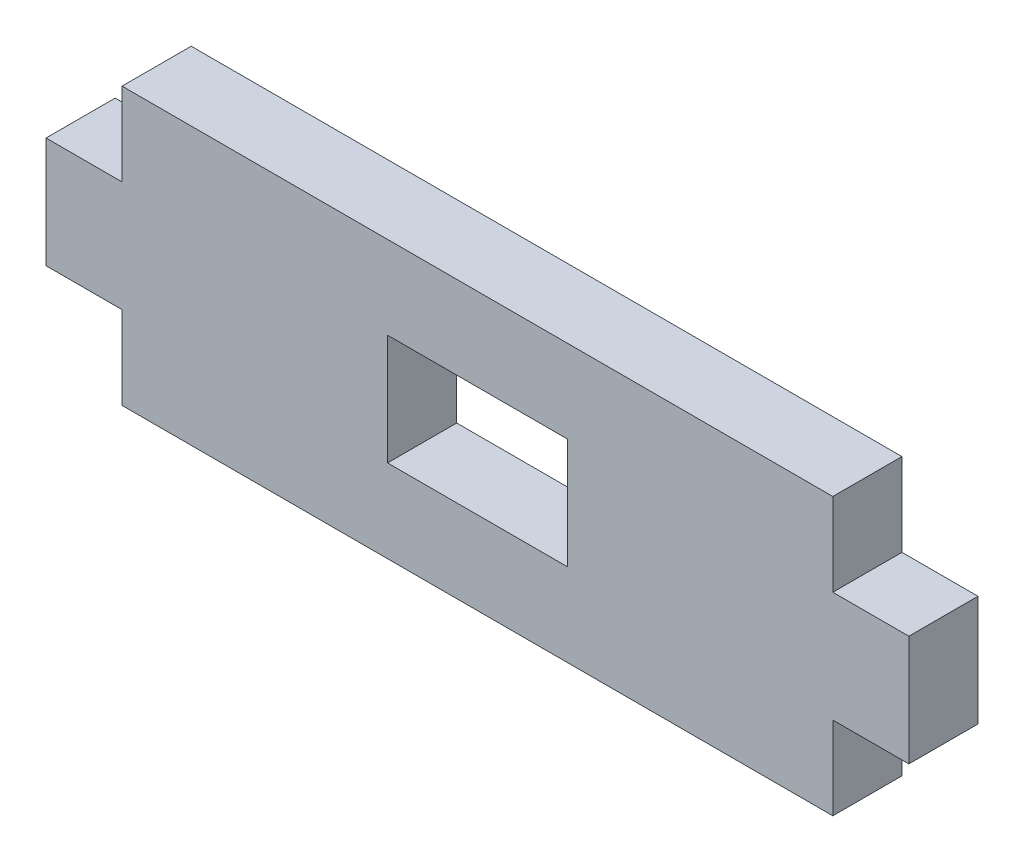
ISO-10303-21;
HEADER;
FILE_DESCRIPTION(('STEP AP214'),'2;1');
FILE_NAME('part.step','',(''),(''),'','','');
FILE_SCHEMA(('AUTOMOTIVE_DESIGN { 1 0 10303 214 1 1 1 1 }'));
ENDSEC;
DATA;
#1=APPLICATION_CONTEXT('core data for automotive mechanical design processes');
#2=APPLICATION_PROTOCOL_DEFINITION('international standard','automotive_design',2000,#1);
#3=PRODUCT_CONTEXT('',#1,'mechanical');
#4=PRODUCT('Part','Part','',(#3));
#5=PRODUCT_RELATED_PRODUCT_CATEGORY('part','',(#4));
#6=PRODUCT_DEFINITION_FORMATION('','',#4);
#7=PRODUCT_DEFINITION_CONTEXT('part definition',#1,'design');
#8=PRODUCT_DEFINITION('design','',#6,#7);
#9=PRODUCT_DEFINITION_SHAPE('','',#8);
#10=(LENGTH_UNIT() NAMED_UNIT(*) SI_UNIT(.MILLI.,.METRE.));
#11=(NAMED_UNIT(*) PLANE_ANGLE_UNIT() SI_UNIT($,.RADIAN.));
#12=(NAMED_UNIT(*) SI_UNIT($,.STERADIAN.) SOLID_ANGLE_UNIT());
#13=UNCERTAINTY_MEASURE_WITH_UNIT(LENGTH_MEASURE(1.E-05),#10,'distance_accuracy_value','');
#14=(GEOMETRIC_REPRESENTATION_CONTEXT(3) GLOBAL_UNCERTAINTY_ASSIGNED_CONTEXT((#13)) GLOBAL_UNIT_ASSIGNED_CONTEXT((#10,
#11,#12)) REPRESENTATION_CONTEXT('',''));
#15=CARTESIAN_POINT('',(0.,0.,0.));
#16=DIRECTION('',(0.,0.,1.));
#17=DIRECTION('',(1.,0.,0.));
#18=AXIS2_PLACEMENT_3D('',#15,#16,#17);
#19=CARTESIAN_POINT('',(25.7,0.,5.));
#20=DIRECTION('',(1.,0.,0.));
#21=DIRECTION('',(0.,1.,0.));
#22=AXIS2_PLACEMENT_3D('',#19,#20,#21);
#23=PLANE('',#22);
#24=DIRECTION('',(0.,-1.,0.));
#25=VECTOR('',#24,1.);
#26=CARTESIAN_POINT('',(25.7,0.,0.));
#27=LINE('',#26,#25);
#28=CARTESIAN_POINT('',(25.7,10.,0.));
#29=VERTEX_POINT('',#28);
#30=CARTESIAN_POINT('',(25.7,4.00000000000001,0.));
#31=VERTEX_POINT('',#30);
#32=EDGE_CURVE('E180',#29,#31,#27,.T.);
#33=ORIENTED_EDGE('',*,*,#32,.F.);
#34=DIRECTION('',(0.,0.,-1.));
#35=VECTOR('',#34,1.);
#36=CARTESIAN_POINT('',(25.7,10.,5.));
#37=LINE('',#36,#35);
#38=CARTESIAN_POINT('',(25.7,10.,5.));
#39=VERTEX_POINT('',#38);
#40=EDGE_CURVE('E11',#39,#29,#37,.T.);
#41=ORIENTED_EDGE('',*,*,#40,.F.);
#42=DIRECTION('',(0.,-1.,0.));
#43=VECTOR('',#42,1.);
#44=CARTESIAN_POINT('',(25.7,0.,5.));
#45=LINE('',#44,#43);
#46=CARTESIAN_POINT('',(25.7,4.00000000000001,5.));
#47=VERTEX_POINT('',#46);
#48=EDGE_CURVE('E184',#39,#47,#45,.T.);
#49=ORIENTED_EDGE('',*,*,#48,.T.);
#50=DIRECTION('',(0.,0.,-1.));
#51=VECTOR('',#50,1.);
#52=CARTESIAN_POINT('',(25.7,4.00000000000001,5.));
#53=LINE('',#52,#51);
#54=EDGE_CURVE('E212',#47,#31,#53,.T.);
#55=ORIENTED_EDGE('',*,*,#54,.T.);
#56=EDGE_LOOP('',(#33,#41,#49,#55));
#57=FACE_BOUND('',#56,.T.);
#58=ADVANCED_FACE('F35',(#57),#23,.T.);
#59=CARTESIAN_POINT('',(0.,10.,5.));
#60=DIRECTION('',(0.,1.,0.));
#61=DIRECTION('',(-1.,0.,0.));
#62=AXIS2_PLACEMENT_3D('',#59,#60,#61);
#63=PLANE('',#62);
#64=DIRECTION('',(1.,0.,0.));
#65=VECTOR('',#64,1.);
#66=CARTESIAN_POINT('',(0.,10.,0.));
#67=LINE('',#66,#65);
#68=CARTESIAN_POINT('',(-25.7,10.,0.));
#69=VERTEX_POINT('',#68);
#70=EDGE_CURVE('E215',#69,#29,#67,.T.);
#71=ORIENTED_EDGE('',*,*,#70,.F.);
#72=DIRECTION('',(0.,0.,-1.));
#73=VECTOR('',#72,1.);
#74=CARTESIAN_POINT('',(-25.7,10.,5.));
#75=LINE('',#74,#73);
#76=CARTESIAN_POINT('',(-25.7,10.,5.));
#77=VERTEX_POINT('',#76);
#78=EDGE_CURVE('E43',#77,#69,#75,.T.);
#79=ORIENTED_EDGE('',*,*,#78,.F.);
#80=DIRECTION('',(1.,0.,0.));
#81=VECTOR('',#80,1.);
#82=CARTESIAN_POINT('',(0.,10.,5.));
#83=LINE('',#82,#81);
#84=EDGE_CURVE('E187',#77,#39,#83,.T.);
#85=ORIENTED_EDGE('',*,*,#84,.T.);
#86=ORIENTED_EDGE('',*,*,#40,.T.);
#87=EDGE_LOOP('',(#71,#79,#85,#86));
#88=FACE_BOUND('',#87,.T.);
#89=ADVANCED_FACE('F37',(#88),#63,.T.);
#90=CARTESIAN_POINT('',(-25.7,0.,5.));
#91=DIRECTION('',(1.,0.,0.));
#92=DIRECTION('',(0.,0.,-1.));
#93=AXIS2_PLACEMENT_3D('',#90,#91,#92);
#94=PLANE('',#93);
#95=DIRECTION('',(0.,-1.,0.));
#96=VECTOR('',#95,1.);
#97=CARTESIAN_POINT('',(-25.7,0.,0.));
#98=LINE('',#97,#96);
#99=CARTESIAN_POINT('',(-25.7,4.,0.));
#100=VERTEX_POINT('',#99);
#101=EDGE_CURVE('E219',#69,#100,#98,.T.);
#102=ORIENTED_EDGE('',*,*,#101,.T.);
#103=DIRECTION('',(0.,0.,-1.));
#104=VECTOR('',#103,1.);
#105=CARTESIAN_POINT('',(-25.7,4.,5.));
#106=LINE('',#105,#104);
#107=CARTESIAN_POINT('',(-25.7,4.,5.));
#108=VERTEX_POINT('',#107);
#109=EDGE_CURVE('E260',#108,#100,#106,.T.);
#110=ORIENTED_EDGE('',*,*,#109,.F.);
#111=DIRECTION('',(0.,-1.,0.));
#112=VECTOR('',#111,1.);
#113=CARTESIAN_POINT('',(-25.7,0.,5.));
#114=LINE('',#113,#112);
#115=EDGE_CURVE('E192',#77,#108,#114,.T.);
#116=ORIENTED_EDGE('',*,*,#115,.F.);
#117=ORIENTED_EDGE('',*,*,#78,.T.);
#118=EDGE_LOOP('',(#102,#110,#116,#117));
#119=FACE_BOUND('',#118,.T.);
#120=ADVANCED_FACE('F265',(#119),#94,.F.);
#121=CARTESIAN_POINT('',(0.,4.,5.));
#122=DIRECTION('',(0.,-1.,0.));
#123=DIRECTION('',(1.,0.,0.));
#124=AXIS2_PLACEMENT_3D('',#121,#122,#123);
#125=PLANE('',#124);
#126=DIRECTION('',(-1.,0.,0.));
#127=VECTOR('',#126,1.);
#128=CARTESIAN_POINT('',(0.,4.,0.));
#129=LINE('',#128,#127);
#130=CARTESIAN_POINT('',(-31.2,4.,0.));
#131=VERTEX_POINT('',#130);
#132=EDGE_CURVE('E221',#100,#131,#129,.T.);
#133=ORIENTED_EDGE('',*,*,#132,.T.);
#134=DIRECTION('',(0.,0.,-1.));
#135=VECTOR('',#134,1.);
#136=CARTESIAN_POINT('',(-31.2,4.,5.));
#137=LINE('',#136,#135);
#138=CARTESIAN_POINT('',(-31.2,4.,5.));
#139=VERTEX_POINT('',#138);
#140=EDGE_CURVE('E257',#139,#131,#137,.T.);
#141=ORIENTED_EDGE('',*,*,#140,.F.);
#142=DIRECTION('',(-1.,0.,0.));
#143=VECTOR('',#142,1.);
#144=CARTESIAN_POINT('',(0.,4.,5.));
#145=LINE('',#144,#143);
#146=EDGE_CURVE('E194',#108,#139,#145,.T.);
#147=ORIENTED_EDGE('',*,*,#146,.F.);
#148=ORIENTED_EDGE('',*,*,#109,.T.);
#149=EDGE_LOOP('',(#133,#141,#147,#148));
#150=FACE_BOUND('',#149,.T.);
#151=ADVANCED_FACE('F315',(#150),#125,.F.);
#152=CARTESIAN_POINT('',(-31.2,0.,5.));
#153=DIRECTION('',(1.,0.,0.));
#154=DIRECTION('',(0.,1.,0.));
#155=AXIS2_PLACEMENT_3D('',#152,#153,#154);
#156=PLANE('',#155);
#157=DIRECTION('',(0.,-1.,0.));
#158=VECTOR('',#157,1.);
#159=CARTESIAN_POINT('',(-31.2,0.,0.));
#160=LINE('',#159,#158);
#161=CARTESIAN_POINT('',(-31.2,-4.,0.));
#162=VERTEX_POINT('',#161);
#163=EDGE_CURVE('E224',#131,#162,#160,.T.);
#164=ORIENTED_EDGE('',*,*,#163,.T.);
#165=DIRECTION('',(0.,0.,-1.));
#166=VECTOR('',#165,1.);
#167=CARTESIAN_POINT('',(-31.2,-4.,5.));
#168=LINE('',#167,#166);
#169=CARTESIAN_POINT('',(-31.2,-4.,5.));
#170=VERTEX_POINT('',#169);
#171=EDGE_CURVE('E254',#170,#162,#168,.T.);
#172=ORIENTED_EDGE('',*,*,#171,.F.);
#173=DIRECTION('',(0.,-1.,0.));
#174=VECTOR('',#173,1.);
#175=CARTESIAN_POINT('',(-31.2,0.,5.));
#176=LINE('',#175,#174);
#177=EDGE_CURVE('E197',#139,#170,#176,.T.);
#178=ORIENTED_EDGE('',*,*,#177,.F.);
#179=ORIENTED_EDGE('',*,*,#140,.T.);
#180=EDGE_LOOP('',(#164,#172,#178,#179));
#181=FACE_BOUND('',#180,.T.);
#182=ADVANCED_FACE('F311',(#181),#156,.F.);
#183=CARTESIAN_POINT('',(0.,-4.,5.));
#184=DIRECTION('',(0.,1.,0.));
#185=DIRECTION('',(0.,0.,1.));
#186=AXIS2_PLACEMENT_3D('',#183,#184,#185);
#187=PLANE('',#186);
#188=DIRECTION('',(1.,0.,0.));
#189=VECTOR('',#188,1.);
#190=CARTESIAN_POINT('',(0.,-4.,0.));
#191=LINE('',#190,#189);
#192=CARTESIAN_POINT('',(-25.7,-4.,0.));
#193=VERTEX_POINT('',#192);
#194=EDGE_CURVE('E226',#162,#193,#191,.T.);
#195=ORIENTED_EDGE('',*,*,#194,.T.);
#196=DIRECTION('',(0.,0.,-1.));
#197=VECTOR('',#196,1.);
#198=CARTESIAN_POINT('',(-25.7,-4.,5.));
#199=LINE('',#198,#197);
#200=CARTESIAN_POINT('',(-25.7,-4.,5.));
#201=VERTEX_POINT('',#200);
#202=EDGE_CURVE('E251',#201,#193,#199,.T.);
#203=ORIENTED_EDGE('',*,*,#202,.F.);
#204=DIRECTION('',(1.,0.,0.));
#205=VECTOR('',#204,1.);
#206=CARTESIAN_POINT('',(0.,-4.,5.));
#207=LINE('',#206,#205);
#208=EDGE_CURVE('E199',#170,#201,#207,.T.);
#209=ORIENTED_EDGE('',*,*,#208,.F.);
#210=ORIENTED_EDGE('',*,*,#171,.T.);
#211=EDGE_LOOP('',(#195,#203,#209,#210));
#212=FACE_BOUND('',#211,.T.);
#213=ADVANCED_FACE('F307',(#212),#187,.F.);
#214=CARTESIAN_POINT('',(-25.7,-10.,0.));
#215=VERTEX_POINT('',#214);
#216=EDGE_CURVE('E222',#193,#215,#98,.T.);
#217=ORIENTED_EDGE('',*,*,#216,.T.);
#218=DIRECTION('',(0.,0.,-1.));
#219=VECTOR('',#218,1.);
#220=CARTESIAN_POINT('',(-25.7,-10.,5.));
#221=LINE('',#220,#219);
#222=CARTESIAN_POINT('',(-25.7,-10.,5.));
#223=VERTEX_POINT('',#222);
#224=EDGE_CURVE('E248',#223,#215,#221,.T.);
#225=ORIENTED_EDGE('',*,*,#224,.F.);
#226=EDGE_CURVE('E195',#201,#223,#114,.T.);
#227=ORIENTED_EDGE('',*,*,#226,.F.);
#228=ORIENTED_EDGE('',*,*,#202,.T.);
#229=EDGE_LOOP('',(#217,#225,#227,#228));
#230=FACE_BOUND('',#229,.T.);
#231=ADVANCED_FACE('F302',(#230),#94,.F.);
#232=CARTESIAN_POINT('',(0.,-10.,5.));
#233=DIRECTION('',(0.,1.,0.));
#234=DIRECTION('',(-1.,0.,0.));
#235=AXIS2_PLACEMENT_3D('',#232,#233,#234);
#236=PLANE('',#235);
#237=DIRECTION('',(1.,0.,0.));
#238=VECTOR('',#237,1.);
#239=CARTESIAN_POINT('',(0.,-10.,0.));
#240=LINE('',#239,#238);
#241=CARTESIAN_POINT('',(25.7,-9.99999999999999,0.));
#242=VERTEX_POINT('',#241);
#243=EDGE_CURVE('E228',#215,#242,#240,.T.);
#244=ORIENTED_EDGE('',*,*,#243,.T.);
#245=DIRECTION('',(0.,0.,-1.));
#246=VECTOR('',#245,1.);
#247=CARTESIAN_POINT('',(25.7,-9.99999999999999,5.));
#248=LINE('',#247,#246);
#249=CARTESIAN_POINT('',(25.7,-9.99999999999999,5.));
#250=VERTEX_POINT('',#249);
#251=EDGE_CURVE('E246',#250,#242,#248,.T.);
#252=ORIENTED_EDGE('',*,*,#251,.F.);
#253=DIRECTION('',(1.,0.,0.));
#254=VECTOR('',#253,1.);
#255=CARTESIAN_POINT('',(0.,-10.,5.));
#256=LINE('',#255,#254);
#257=EDGE_CURVE('E201',#223,#250,#256,.T.);
#258=ORIENTED_EDGE('',*,*,#257,.F.);
#259=ORIENTED_EDGE('',*,*,#224,.T.);
#260=EDGE_LOOP('',(#244,#252,#258,#259));
#261=FACE_BOUND('',#260,.T.);
#262=ADVANCED_FACE('F297',(#261),#236,.F.);
#263=CARTESIAN_POINT('',(25.7,-3.99999999999999,0.));
#264=VERTEX_POINT('',#263);
#265=EDGE_CURVE('E216',#264,#242,#27,.T.);
#266=ORIENTED_EDGE('',*,*,#265,.F.);
#267=DIRECTION('',(0.,0.,-1.));
#268=VECTOR('',#267,1.);
#269=CARTESIAN_POINT('',(25.7,-3.99999999999999,5.));
#270=LINE('',#269,#268);
#271=CARTESIAN_POINT('',(25.7,-3.99999999999999,5.));
#272=VERTEX_POINT('',#271);
#273=EDGE_CURVE('E244',#272,#264,#270,.T.);
#274=ORIENTED_EDGE('',*,*,#273,.F.);
#275=EDGE_CURVE('E189',#272,#250,#45,.T.);
#276=ORIENTED_EDGE('',*,*,#275,.T.);
#277=ORIENTED_EDGE('',*,*,#251,.T.);
#278=EDGE_LOOP('',(#266,#274,#276,#277));
#279=FACE_BOUND('',#278,.T.);
#280=ADVANCED_FACE('F293',(#279),#23,.T.);
#281=CARTESIAN_POINT('',(0.,-4.,5.));
#282=DIRECTION('',(0.,-1.,0.));
#283=DIRECTION('',(1.,0.,0.));
#284=AXIS2_PLACEMENT_3D('',#281,#282,#283);
#285=PLANE('',#284);
#286=DIRECTION('',(-1.,0.,0.));
#287=VECTOR('',#286,1.);
#288=CARTESIAN_POINT('',(0.,-4.,0.));
#289=LINE('',#288,#287);
#290=CARTESIAN_POINT('',(31.2,-3.99999999999999,0.));
#291=VERTEX_POINT('',#290);
#292=EDGE_CURVE('E231',#291,#264,#289,.T.);
#293=ORIENTED_EDGE('',*,*,#292,.F.);
#294=DIRECTION('',(0.,0.,-1.));
#295=VECTOR('',#294,1.);
#296=CARTESIAN_POINT('',(31.2,-3.99999999999999,5.));
#297=LINE('',#296,#295);
#298=CARTESIAN_POINT('',(31.2,-3.99999999999999,5.));
#299=VERTEX_POINT('',#298);
#300=EDGE_CURVE('E242',#299,#291,#297,.T.);
#301=ORIENTED_EDGE('',*,*,#300,.F.);
#302=DIRECTION('',(-1.,0.,0.));
#303=VECTOR('',#302,1.);
#304=CARTESIAN_POINT('',(0.,-4.,5.));
#305=LINE('',#304,#303);
#306=EDGE_CURVE('E203',#299,#272,#305,.T.);
#307=ORIENTED_EDGE('',*,*,#306,.T.);
#308=ORIENTED_EDGE('',*,*,#273,.T.);
#309=EDGE_LOOP('',(#293,#301,#307,#308));
#310=FACE_BOUND('',#309,.T.);
#311=ADVANCED_FACE('F288',(#310),#285,.T.);
#312=CARTESIAN_POINT('',(31.2,0.,5.));
#313=DIRECTION('',(1.,0.,0.));
#314=DIRECTION('',(0.,1.,0.));
#315=AXIS2_PLACEMENT_3D('',#312,#313,#314);
#316=PLANE('',#315);
#317=DIRECTION('',(0.,-1.,0.));
#318=VECTOR('',#317,1.);
#319=CARTESIAN_POINT('',(31.2,0.,0.));
#320=LINE('',#319,#318);
#321=CARTESIAN_POINT('',(31.2,4.00000000000001,0.));
#322=VERTEX_POINT('',#321);
#323=EDGE_CURVE('E234',#322,#291,#320,.T.);
#324=ORIENTED_EDGE('',*,*,#323,.F.);
#325=DIRECTION('',(0.,0.,-1.));
#326=VECTOR('',#325,1.);
#327=CARTESIAN_POINT('',(31.2,4.00000000000001,5.));
#328=LINE('',#327,#326);
#329=CARTESIAN_POINT('',(31.2,4.00000000000001,5.));
#330=VERTEX_POINT('',#329);
#331=EDGE_CURVE('E240',#330,#322,#328,.T.);
#332=ORIENTED_EDGE('',*,*,#331,.F.);
#333=DIRECTION('',(0.,-1.,0.));
#334=VECTOR('',#333,1.);
#335=CARTESIAN_POINT('',(31.2,0.,5.));
#336=LINE('',#335,#334);
#337=EDGE_CURVE('E206',#330,#299,#336,.T.);
#338=ORIENTED_EDGE('',*,*,#337,.T.);
#339=ORIENTED_EDGE('',*,*,#300,.T.);
#340=EDGE_LOOP('',(#324,#332,#338,#339));
#341=FACE_BOUND('',#340,.T.);
#342=ADVANCED_FACE('F282',(#341),#316,.T.);
#343=CARTESIAN_POINT('',(0.,4.,5.));
#344=DIRECTION('',(0.,1.,0.));
#345=DIRECTION('',(-1.,0.,0.));
#346=AXIS2_PLACEMENT_3D('',#343,#344,#345);
#347=PLANE('',#346);
#348=DIRECTION('',(1.,0.,0.));
#349=VECTOR('',#348,1.);
#350=CARTESIAN_POINT('',(0.,4.,0.));
#351=LINE('',#350,#349);
#352=EDGE_CURVE('E188',#31,#322,#351,.T.);
#353=ORIENTED_EDGE('',*,*,#352,.F.);
#354=ORIENTED_EDGE('',*,*,#54,.F.);
#355=DIRECTION('',(1.,0.,0.));
#356=VECTOR('',#355,1.);
#357=CARTESIAN_POINT('',(0.,4.,5.));
#358=LINE('',#357,#356);
#359=EDGE_CURVE('E209',#47,#330,#358,.T.);
#360=ORIENTED_EDGE('',*,*,#359,.T.);
#361=ORIENTED_EDGE('',*,*,#331,.T.);
#362=EDGE_LOOP('',(#353,#354,#360,#361));
#363=FACE_BOUND('',#362,.T.);
#364=ADVANCED_FACE('F277',(#363),#347,.T.);
#365=CARTESIAN_POINT('',(0.,0.,5.));
#366=DIRECTION('',(0.,0.,1.));
#367=DIRECTION('',(1.,0.,0.));
#368=AXIS2_PLACEMENT_3D('',#365,#366,#367);
#369=PLANE('',#368);
#370=DIRECTION('',(0.,1.,0.));
#371=VECTOR('',#370,1.);
#372=CARTESIAN_POINT('',(6.5,4.,5.));
#373=LINE('',#372,#371);
#374=CARTESIAN_POINT('',(6.5,-4.,5.));
#375=VERTEX_POINT('',#374);
#376=CARTESIAN_POINT('',(6.5,4.,5.));
#377=VERTEX_POINT('',#376);
#378=EDGE_CURVE('E50',#375,#377,#373,.T.);
#379=ORIENTED_EDGE('',*,*,#378,.F.);
#380=DIRECTION('',(1.,0.,0.));
#381=VECTOR('',#380,1.);
#382=CARTESIAN_POINT('',(-6.5,-4.,5.));
#383=LINE('',#382,#381);
#384=CARTESIAN_POINT('',(-6.5,-4.,5.));
#385=VERTEX_POINT('',#384);
#386=EDGE_CURVE('E165',#385,#375,#383,.T.);
#387=ORIENTED_EDGE('',*,*,#386,.F.);
#388=DIRECTION('',(0.,-1.,0.));
#389=VECTOR('',#388,1.);
#390=CARTESIAN_POINT('',(-6.5,4.,5.));
#391=LINE('',#390,#389);
#392=CARTESIAN_POINT('',(-6.5,4.,5.));
#393=VERTEX_POINT('',#392);
#394=EDGE_CURVE('E168',#393,#385,#391,.T.);
#395=ORIENTED_EDGE('',*,*,#394,.F.);
#396=DIRECTION('',(-1.,0.,0.));
#397=VECTOR('',#396,1.);
#398=CARTESIAN_POINT('',(-6.5,4.,5.));
#399=LINE('',#398,#397);
#400=EDGE_CURVE('E174',#377,#393,#399,.T.);
#401=ORIENTED_EDGE('',*,*,#400,.F.);
#402=EDGE_LOOP('',(#379,#387,#395,#401));
#403=FACE_BOUND('',#402,.T.);
#404=ORIENTED_EDGE('',*,*,#48,.F.);
#405=ORIENTED_EDGE('',*,*,#84,.F.);
#406=ORIENTED_EDGE('',*,*,#115,.T.);
#407=ORIENTED_EDGE('',*,*,#146,.T.);
#408=ORIENTED_EDGE('',*,*,#177,.T.);
#409=ORIENTED_EDGE('',*,*,#208,.T.);
#410=ORIENTED_EDGE('',*,*,#226,.T.);
#411=ORIENTED_EDGE('',*,*,#257,.T.);
#412=ORIENTED_EDGE('',*,*,#275,.F.);
#413=ORIENTED_EDGE('',*,*,#306,.F.);
#414=ORIENTED_EDGE('',*,*,#337,.F.);
#415=ORIENTED_EDGE('',*,*,#359,.F.);
#416=EDGE_LOOP('',(#404,#405,#406,#407,#408,#409,#410,#411,#412,#413,#414,#415));
#417=FACE_BOUND('',#416,.T.);
#418=ADVANCED_FACE('F317',(#403,#417),#369,.T.);
#419=CARTESIAN_POINT('',(0.,0.,0.));
#420=DIRECTION('',(0.,0.,1.));
#421=DIRECTION('',(1.,0.,0.));
#422=AXIS2_PLACEMENT_3D('',#419,#420,#421);
#423=PLANE('',#422);
#424=DIRECTION('',(1.,0.,0.));
#425=VECTOR('',#424,1.);
#426=CARTESIAN_POINT('',(-6.5,-4.,0.));
#427=LINE('',#426,#425);
#428=CARTESIAN_POINT('',(-6.5,-4.,0.));
#429=VERTEX_POINT('',#428);
#430=CARTESIAN_POINT('',(6.5,-4.,0.));
#431=VERTEX_POINT('',#430);
#432=EDGE_CURVE('E155',#429,#431,#427,.T.);
#433=ORIENTED_EDGE('',*,*,#432,.T.);
#434=DIRECTION('',(0.,1.,0.));
#435=VECTOR('',#434,1.);
#436=CARTESIAN_POINT('',(6.5,4.,0.));
#437=LINE('',#436,#435);
#438=CARTESIAN_POINT('',(6.5,4.,0.));
#439=VERTEX_POINT('',#438);
#440=EDGE_CURVE('E149',#431,#439,#437,.T.);
#441=ORIENTED_EDGE('',*,*,#440,.T.);
#442=DIRECTION('',(-1.,0.,0.));
#443=VECTOR('',#442,1.);
#444=CARTESIAN_POINT('',(-6.5,4.,0.));
#445=LINE('',#444,#443);
#446=CARTESIAN_POINT('',(-6.5,4.,0.));
#447=VERTEX_POINT('',#446);
#448=EDGE_CURVE('E158',#439,#447,#445,.T.);
#449=ORIENTED_EDGE('',*,*,#448,.T.);
#450=DIRECTION('',(0.,-1.,0.));
#451=VECTOR('',#450,1.);
#452=CARTESIAN_POINT('',(-6.5,4.,0.));
#453=LINE('',#452,#451);
#454=EDGE_CURVE('E58',#447,#429,#453,.T.);
#455=ORIENTED_EDGE('',*,*,#454,.T.);
#456=EDGE_LOOP('',(#433,#441,#449,#455));
#457=FACE_BOUND('',#456,.T.);
#458=ORIENTED_EDGE('',*,*,#32,.T.);
#459=ORIENTED_EDGE('',*,*,#352,.T.);
#460=ORIENTED_EDGE('',*,*,#323,.T.);
#461=ORIENTED_EDGE('',*,*,#292,.T.);
#462=ORIENTED_EDGE('',*,*,#265,.T.);
#463=ORIENTED_EDGE('',*,*,#243,.F.);
#464=ORIENTED_EDGE('',*,*,#216,.F.);
#465=ORIENTED_EDGE('',*,*,#194,.F.);
#466=ORIENTED_EDGE('',*,*,#163,.F.);
#467=ORIENTED_EDGE('',*,*,#132,.F.);
#468=ORIENTED_EDGE('',*,*,#101,.F.);
#469=ORIENTED_EDGE('',*,*,#70,.T.);
#470=EDGE_LOOP('',(#458,#459,#460,#461,#462,#463,#464,#465,#466,#467,#468,#469));
#471=FACE_BOUND('',#470,.T.);
#472=ADVANCED_FACE('F162',(#457,#471),#423,.F.);
#473=CARTESIAN_POINT('',(6.5,4.,0.));
#474=DIRECTION('',(1.,0.,0.));
#475=DIRECTION('',(0.,1.,0.));
#476=AXIS2_PLACEMENT_3D('',#473,#474,#475);
#477=PLANE('',#476);
#478=ORIENTED_EDGE('',*,*,#378,.T.);
#479=DIRECTION('',(0.,0.,1.));
#480=VECTOR('',#479,1.);
#481=CARTESIAN_POINT('',(6.5,4.,0.));
#482=LINE('',#481,#480);
#483=EDGE_CURVE('E145',#439,#377,#482,.T.);
#484=ORIENTED_EDGE('',*,*,#483,.F.);
#485=ORIENTED_EDGE('',*,*,#440,.F.);
#486=DIRECTION('',(0.,0.,1.));
#487=VECTOR('',#486,1.);
#488=CARTESIAN_POINT('',(6.5,-4.,0.));
#489=LINE('',#488,#487);
#490=EDGE_CURVE('E178',#431,#375,#489,.T.);
#491=ORIENTED_EDGE('',*,*,#490,.T.);
#492=EDGE_LOOP('',(#478,#484,#485,#491));
#493=FACE_BOUND('',#492,.T.);
#494=ADVANCED_FACE('F147',(#493),#477,.F.);
#495=CARTESIAN_POINT('',(-6.5,-4.,0.));
#496=DIRECTION('',(0.,-1.,0.));
#497=DIRECTION('',(0.,0.,-1.));
#498=AXIS2_PLACEMENT_3D('',#495,#496,#497);
#499=PLANE('',#498);
#500=ORIENTED_EDGE('',*,*,#386,.T.);
#501=ORIENTED_EDGE('',*,*,#490,.F.);
#502=ORIENTED_EDGE('',*,*,#432,.F.);
#503=DIRECTION('',(0.,0.,1.));
#504=VECTOR('',#503,1.);
#505=CARTESIAN_POINT('',(-6.5,-4.,0.));
#506=LINE('',#505,#504);
#507=EDGE_CURVE('E181',#429,#385,#506,.T.);
#508=ORIENTED_EDGE('',*,*,#507,.T.);
#509=EDGE_LOOP('',(#500,#501,#502,#508));
#510=FACE_BOUND('',#509,.T.);
#511=ADVANCED_FACE('F469',(#510),#499,.F.);
#512=CARTESIAN_POINT('',(-6.5,4.,0.));
#513=DIRECTION('',(-1.,0.,0.));
#514=DIRECTION('',(0.,-1.,0.));
#515=AXIS2_PLACEMENT_3D('',#512,#513,#514);
#516=PLANE('',#515);
#517=ORIENTED_EDGE('',*,*,#394,.T.);
#518=ORIENTED_EDGE('',*,*,#507,.F.);
#519=ORIENTED_EDGE('',*,*,#454,.F.);
#520=DIRECTION('',(0.,0.,1.));
#521=VECTOR('',#520,1.);
#522=CARTESIAN_POINT('',(-6.5,4.,0.));
#523=LINE('',#522,#521);
#524=EDGE_CURVE('E154',#447,#393,#523,.T.);
#525=ORIENTED_EDGE('',*,*,#524,.T.);
#526=EDGE_LOOP('',(#517,#518,#519,#525));
#527=FACE_BOUND('',#526,.T.);
#528=ADVANCED_FACE('F476',(#527),#516,.F.);
#529=CARTESIAN_POINT('',(-6.5,4.,0.));
#530=DIRECTION('',(0.,1.,0.));
#531=DIRECTION('',(0.,0.,1.));
#532=AXIS2_PLACEMENT_3D('',#529,#530,#531);
#533=PLANE('',#532);
#534=ORIENTED_EDGE('',*,*,#400,.T.);
#535=ORIENTED_EDGE('',*,*,#524,.F.);
#536=ORIENTED_EDGE('',*,*,#448,.F.);
#537=ORIENTED_EDGE('',*,*,#483,.T.);
#538=EDGE_LOOP('',(#534,#535,#536,#537));
#539=FACE_BOUND('',#538,.T.);
#540=ADVANCED_FACE('F159',(#539),#533,.F.);
#541=CLOSED_SHELL('',(#58,#89,#120,#151,#182,#213,#231,#262,#280,#311,#342,#364,#418,#472,#494,
#511,#528,#540));
#542=MANIFOLD_SOLID_BREP('B2',#541);
#543=ADVANCED_BREP_SHAPE_REPRESENTATION('',(#18,#542),#14);
#544=SHAPE_DEFINITION_REPRESENTATION(#9,#543);
ENDSEC;
END-ISO-10303-21;
